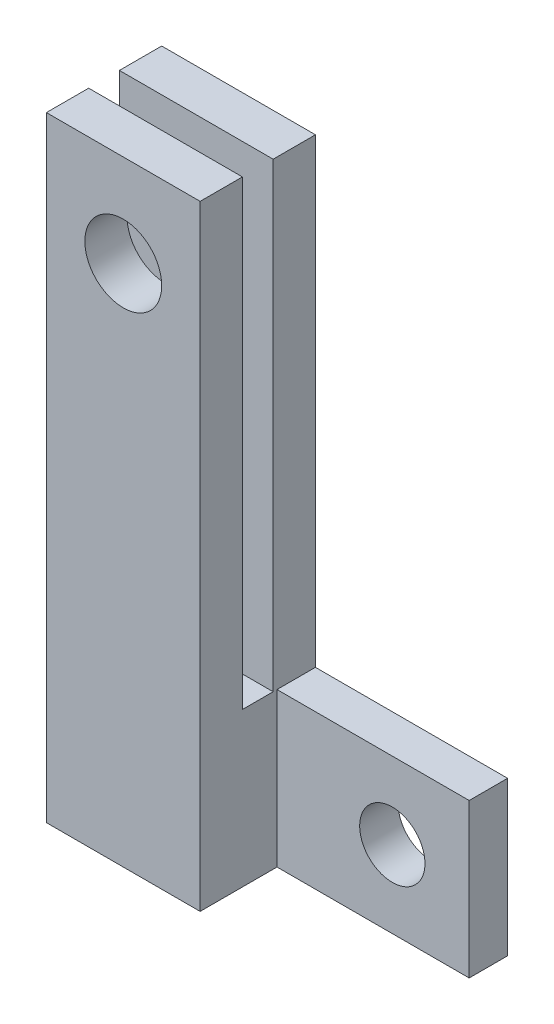
ISO-10303-21;
HEADER;
FILE_DESCRIPTION(('STEP AP214'),'2;1');
FILE_NAME('part.step','',(''),(''),'','','');
FILE_SCHEMA(('AUTOMOTIVE_DESIGN { 1 0 10303 214 1 1 1 1 }'));
ENDSEC;
DATA;
#1=APPLICATION_CONTEXT('core data for automotive mechanical design processes');
#2=APPLICATION_PROTOCOL_DEFINITION('international standard','automotive_design',2000,#1);
#3=PRODUCT_CONTEXT('',#1,'mechanical');
#4=PRODUCT('Part','Part','',(#3));
#5=PRODUCT_RELATED_PRODUCT_CATEGORY('part','',(#4));
#6=PRODUCT_DEFINITION_FORMATION('','',#4);
#7=PRODUCT_DEFINITION_CONTEXT('part definition',#1,'design');
#8=PRODUCT_DEFINITION('design','',#6,#7);
#9=PRODUCT_DEFINITION_SHAPE('','',#8);
#10=(LENGTH_UNIT() NAMED_UNIT(*) SI_UNIT(.MILLI.,.METRE.));
#11=(NAMED_UNIT(*) PLANE_ANGLE_UNIT() SI_UNIT($,.RADIAN.));
#12=(NAMED_UNIT(*) SI_UNIT($,.STERADIAN.) SOLID_ANGLE_UNIT());
#13=UNCERTAINTY_MEASURE_WITH_UNIT(LENGTH_MEASURE(1.E-05),#10,'distance_accuracy_value','');
#14=(GEOMETRIC_REPRESENTATION_CONTEXT(3) GLOBAL_UNCERTAINTY_ASSIGNED_CONTEXT((#13)) GLOBAL_UNIT_ASSIGNED_CONTEXT((#10,
#11,#12)) REPRESENTATION_CONTEXT('',''));
#15=CARTESIAN_POINT('',(0.,0.,0.));
#16=DIRECTION('',(0.,0.,1.));
#17=DIRECTION('',(1.,0.,0.));
#18=AXIS2_PLACEMENT_3D('',#15,#16,#17);
#19=CARTESIAN_POINT('',(-10.,30.8594023067002,15.));
#20=DIRECTION('',(1.,0.,0.));
#21=DIRECTION('',(0.,1.,0.));
#22=AXIS2_PLACEMENT_3D('',#19,#20,#21);
#23=PLANE('',#22);
#24=DIRECTION('',(0.,0.,-1.));
#25=VECTOR('',#24,1.);
#26=CARTESIAN_POINT('',(-10.,-31.1227531452276,0.));
#27=LINE('',#26,#25);
#28=CARTESIAN_POINT('',(-10.,-31.1227531452276,12.));
#29=VERTEX_POINT('',#28);
#30=CARTESIAN_POINT('',(-10.,-31.1227531452276,0.));
#31=VERTEX_POINT('',#30);
#32=EDGE_CURVE('E59',#29,#31,#27,.T.);
#33=ORIENTED_EDGE('',*,*,#32,.F.);
#34=DIRECTION('',(0.,1.,0.));
#35=VECTOR('',#34,1.);
#36=CARTESIAN_POINT('',(-10.,-31.1227531452276,12.));
#37=LINE('',#36,#35);
#38=CARTESIAN_POINT('',(-9.99999999999999,-47.1227531452276,12.));
#39=VERTEX_POINT('',#38);
#40=EDGE_CURVE('E459',#39,#29,#37,.T.);
#41=ORIENTED_EDGE('',*,*,#40,.F.);
#42=DIRECTION('',(0.,0.,1.));
#43=VECTOR('',#42,1.);
#44=CARTESIAN_POINT('',(-9.99999999999999,-47.1227531452276,12.));
#45=LINE('',#44,#43);
#46=CARTESIAN_POINT('',(-9.99999999999999,-47.1227531452276,0.));
#47=VERTEX_POINT('',#46);
#48=EDGE_CURVE('E458',#47,#39,#45,.T.);
#49=ORIENTED_EDGE('',*,*,#48,.F.);
#50=DIRECTION('',(0.,-1.,0.));
#51=VECTOR('',#50,1.);
#52=CARTESIAN_POINT('',(-10.,30.8594023067002,0.));
#53=LINE('',#52,#51);
#54=CARTESIAN_POINT('',(-9.99999999999999,-49.1405976932998,0.));
#55=VERTEX_POINT('',#54);
#56=EDGE_CURVE('E200',#47,#55,#53,.T.);
#57=ORIENTED_EDGE('',*,*,#56,.T.);
#58=DIRECTION('',(0.,0.,-1.));
#59=VECTOR('',#58,1.);
#60=CARTESIAN_POINT('',(-9.99999999999999,-49.1405976932998,5.));
#61=LINE('',#60,#59);
#62=CARTESIAN_POINT('',(-9.99999999999999,-49.1405976932998,15.));
#63=VERTEX_POINT('',#62);
#64=EDGE_CURVE('E287',#63,#55,#61,.T.);
#65=ORIENTED_EDGE('',*,*,#64,.F.);
#66=DIRECTION('',(0.,-1.,0.));
#67=VECTOR('',#66,1.);
#68=CARTESIAN_POINT('',(-10.,30.8594023067002,15.));
#69=LINE('',#68,#67);
#70=CARTESIAN_POINT('',(-10.,30.8594023067002,15.));
#71=VERTEX_POINT('',#70);
#72=EDGE_CURVE('E353',#71,#63,#69,.T.);
#73=ORIENTED_EDGE('',*,*,#72,.F.);
#74=DIRECTION('',(0.,0.,-1.));
#75=VECTOR('',#74,1.);
#76=CARTESIAN_POINT('',(-10.,30.8594023067002,15.));
#77=LINE('',#76,#75);
#78=CARTESIAN_POINT('',(-10.,30.8594023067002,9.5));
#79=VERTEX_POINT('',#78);
#80=EDGE_CURVE('E365',#71,#79,#77,.T.);
#81=ORIENTED_EDGE('',*,*,#80,.T.);
#82=DIRECTION('',(0.,1.,0.));
#83=VECTOR('',#82,1.);
#84=CARTESIAN_POINT('',(-10.,-29.1405976932998,9.5));
#85=LINE('',#84,#83);
#86=CARTESIAN_POINT('',(-10.,-29.1405976932998,9.5));
#87=VERTEX_POINT('',#86);
#88=EDGE_CURVE('E337',#87,#79,#85,.T.);
#89=ORIENTED_EDGE('',*,*,#88,.F.);
#90=DIRECTION('',(0.,0.,1.));
#91=VECTOR('',#90,1.);
#92=CARTESIAN_POINT('',(-10.,-29.1405976932998,5.5));
#93=LINE('',#92,#91);
#94=CARTESIAN_POINT('',(-10.,-29.1405976932998,5.5));
#95=VERTEX_POINT('',#94);
#96=EDGE_CURVE('E320',#95,#87,#93,.T.);
#97=ORIENTED_EDGE('',*,*,#96,.F.);
#98=DIRECTION('',(0.,1.,0.));
#99=VECTOR('',#98,1.);
#100=CARTESIAN_POINT('',(-10.,-29.1405976932998,5.5));
#101=LINE('',#100,#99);
#102=CARTESIAN_POINT('',(-10.,30.8594023067002,5.5));
#103=VERTEX_POINT('',#102);
#104=EDGE_CURVE('E340',#95,#103,#101,.T.);
#105=ORIENTED_EDGE('',*,*,#104,.T.);
#106=CARTESIAN_POINT('',(-10.,30.8594023067002,0.));
#107=VERTEX_POINT('',#106);
#108=EDGE_CURVE('E356',#103,#107,#77,.T.);
#109=ORIENTED_EDGE('',*,*,#108,.T.);
#110=EDGE_CURVE('E64',#107,#31,#53,.T.);
#111=ORIENTED_EDGE('',*,*,#110,.T.);
#112=EDGE_LOOP('',(#33,#41,#49,#57,#65,#73,#81,#89,#97,#105,#109,#111));
#113=FACE_BOUND('',#112,.T.);
#114=ADVANCED_FACE('F41',(#113),#23,.F.);
#115=CARTESIAN_POINT('',(0.,0.,5.));
#116=DIRECTION('',(0.,0.,-1.));
#117=DIRECTION('',(-1.,0.,0.));
#118=AXIS2_PLACEMENT_3D('',#115,#116,#117);
#119=PLANE('',#118);
#120=CARTESIAN_POINT('',(25.,-39.1227531452276,5.));
#121=DIRECTION('',(0.,0.,-1.));
#122=DIRECTION('',(-1.,0.,0.));
#123=AXIS2_PLACEMENT_3D('',#120,#121,#122);
#124=CIRCLE('',#123,4.25000000000001);
#125=CARTESIAN_POINT('',(20.75,-39.1227531452276,5.));
#126=VERTEX_POINT('',#125);
#127=EDGE_CURVE('E45',#126,#126,#124,.T.);
#128=ORIENTED_EDGE('',*,*,#127,.T.);
#129=EDGE_LOOP('',(#128));
#130=FACE_BOUND('',#129,.T.);
#131=DIRECTION('',(0.,-1.,0.));
#132=VECTOR('',#131,1.);
#133=CARTESIAN_POINT('',(10.,30.8594023067002,5.));
#134=LINE('',#133,#132);
#135=CARTESIAN_POINT('',(10.,-29.1405976932998,5.));
#136=VERTEX_POINT('',#135);
#137=CARTESIAN_POINT('',(10.,-49.1405976932998,5.));
#138=VERTEX_POINT('',#137);
#139=EDGE_CURVE('E295',#136,#138,#134,.T.);
#140=ORIENTED_EDGE('',*,*,#139,.T.);
#141=DIRECTION('',(-1.,0.,0.));
#142=VECTOR('',#141,1.);
#143=CARTESIAN_POINT('',(35.,-49.1405976932998,5.));
#144=LINE('',#143,#142);
#145=CARTESIAN_POINT('',(35.,-49.1405976932998,5.));
#146=VERTEX_POINT('',#145);
#147=EDGE_CURVE('E264',#146,#138,#144,.T.);
#148=ORIENTED_EDGE('',*,*,#147,.F.);
#149=DIRECTION('',(0.,-1.,0.));
#150=VECTOR('',#149,1.);
#151=CARTESIAN_POINT('',(35.,-29.1405976932998,5.));
#152=LINE('',#151,#150);
#153=CARTESIAN_POINT('',(35.,-29.1405976932998,5.));
#154=VERTEX_POINT('',#153);
#155=EDGE_CURVE('E260',#154,#146,#152,.T.);
#156=ORIENTED_EDGE('',*,*,#155,.F.);
#157=DIRECTION('',(1.,0.,0.));
#158=VECTOR('',#157,1.);
#159=CARTESIAN_POINT('',(-9.99999999999999,-29.1405976932998,5.));
#160=LINE('',#159,#158);
#161=EDGE_CURVE('E269',#136,#154,#160,.T.);
#162=ORIENTED_EDGE('',*,*,#161,.F.);
#163=EDGE_LOOP('',(#140,#148,#156,#162));
#164=FACE_BOUND('',#163,.T.);
#165=ADVANCED_FACE('F392',(#130,#164),#119,.F.);
#166=CARTESIAN_POINT('',(-10.,30.8594023067002,15.));
#167=DIRECTION('',(0.,-1.,0.));
#168=DIRECTION('',(0.,0.,-1.));
#169=AXIS2_PLACEMENT_3D('',#166,#167,#168);
#170=PLANE('',#169);
#171=DIRECTION('',(0.,0.,-1.));
#172=VECTOR('',#171,1.);
#173=CARTESIAN_POINT('',(10.,30.8594023067002,15.));
#174=LINE('',#173,#172);
#175=CARTESIAN_POINT('',(10.,30.8594023067002,15.));
#176=VERTEX_POINT('',#175);
#177=CARTESIAN_POINT('',(10.,30.8594023067002,9.5));
#178=VERTEX_POINT('',#177);
#179=EDGE_CURVE('E11',#176,#178,#174,.T.);
#180=ORIENTED_EDGE('',*,*,#179,.T.);
#181=DIRECTION('',(1.,0.,0.));
#182=VECTOR('',#181,1.);
#183=CARTESIAN_POINT('',(-10.,30.8594023067002,9.5));
#184=LINE('',#183,#182);
#185=EDGE_CURVE('E317',#79,#178,#184,.T.);
#186=ORIENTED_EDGE('',*,*,#185,.F.);
#187=ORIENTED_EDGE('',*,*,#80,.F.);
#188=DIRECTION('',(-1.,0.,0.));
#189=VECTOR('',#188,1.);
#190=CARTESIAN_POINT('',(-10.,30.8594023067002,15.));
#191=LINE('',#190,#189);
#192=EDGE_CURVE('E350',#176,#71,#191,.T.);
#193=ORIENTED_EDGE('',*,*,#192,.F.);
#194=EDGE_LOOP('',(#180,#186,#187,#193));
#195=FACE_BOUND('',#194,.T.);
#196=ADVANCED_FACE('F399',(#195),#170,.F.);
#197=CARTESIAN_POINT('',(10.,30.8594023067002,15.));
#198=DIRECTION('',(-1.,0.,0.));
#199=DIRECTION('',(0.,-1.,0.));
#200=AXIS2_PLACEMENT_3D('',#197,#198,#199);
#201=PLANE('',#200);
#202=ORIENTED_EDGE('',*,*,#139,.F.);
#203=DIRECTION('',(0.,0.,-1.));
#204=VECTOR('',#203,1.);
#205=CARTESIAN_POINT('',(10.,-29.1405976932998,15.));
#206=LINE('',#205,#204);
#207=CARTESIAN_POINT('',(10.,-29.1405976932998,0.));
#208=VERTEX_POINT('',#207);
#209=EDGE_CURVE('E286',#136,#208,#206,.T.);
#210=ORIENTED_EDGE('',*,*,#209,.T.);
#211=DIRECTION('',(0.,1.,0.));
#212=VECTOR('',#211,1.);
#213=CARTESIAN_POINT('',(10.,30.8594023067002,0.));
#214=LINE('',#213,#212);
#215=CARTESIAN_POINT('',(10.,30.8594023067002,0.));
#216=VERTEX_POINT('',#215);
#217=EDGE_CURVE('E336',#208,#216,#214,.T.);
#218=ORIENTED_EDGE('',*,*,#217,.T.);
#219=CARTESIAN_POINT('',(10.,30.8594023067002,5.5));
#220=VERTEX_POINT('',#219);
#221=EDGE_CURVE('E51',#220,#216,#174,.T.);
#222=ORIENTED_EDGE('',*,*,#221,.F.);
#223=DIRECTION('',(0.,1.,0.));
#224=VECTOR('',#223,1.);
#225=CARTESIAN_POINT('',(10.,-29.1405976932998,5.5));
#226=LINE('',#225,#224);
#227=CARTESIAN_POINT('',(10.,-29.1405976932998,5.5));
#228=VERTEX_POINT('',#227);
#229=EDGE_CURVE('E327',#228,#220,#226,.T.);
#230=ORIENTED_EDGE('',*,*,#229,.F.);
#231=DIRECTION('',(0.,0.,-1.));
#232=VECTOR('',#231,1.);
#233=CARTESIAN_POINT('',(10.,-29.1405976932998,5.5));
#234=LINE('',#233,#232);
#235=CARTESIAN_POINT('',(10.,-29.1405976932998,9.5));
#236=VERTEX_POINT('',#235);
#237=EDGE_CURVE('E312',#236,#228,#234,.T.);
#238=ORIENTED_EDGE('',*,*,#237,.F.);
#239=DIRECTION('',(0.,1.,0.));
#240=VECTOR('',#239,1.);
#241=CARTESIAN_POINT('',(10.,-29.1405976932998,9.5));
#242=LINE('',#241,#240);
#243=EDGE_CURVE('E332',#236,#178,#242,.T.);
#244=ORIENTED_EDGE('',*,*,#243,.T.);
#245=ORIENTED_EDGE('',*,*,#179,.F.);
#246=DIRECTION('',(0.,1.,0.));
#247=VECTOR('',#246,1.);
#248=CARTESIAN_POINT('',(10.,30.8594023067002,15.));
#249=LINE('',#248,#247);
#250=CARTESIAN_POINT('',(10.,-49.1405976932998,15.));
#251=VERTEX_POINT('',#250);
#252=EDGE_CURVE('E346',#251,#176,#249,.T.);
#253=ORIENTED_EDGE('',*,*,#252,.F.);
#254=DIRECTION('',(0.,0.,-1.));
#255=VECTOR('',#254,1.);
#256=CARTESIAN_POINT('',(10.,-49.1405976932998,15.));
#257=LINE('',#256,#255);
#258=EDGE_CURVE('E252',#251,#138,#257,.T.);
#259=ORIENTED_EDGE('',*,*,#258,.T.);
#260=EDGE_LOOP('',(#202,#210,#218,#222,#230,#238,#244,#245,#253,#259));
#261=FACE_BOUND('',#260,.T.);
#262=ADVANCED_FACE('F43',(#261),#201,.F.);
#263=ORIENTED_EDGE('',*,*,#108,.F.);
#264=DIRECTION('',(-1.,0.,0.));
#265=VECTOR('',#264,1.);
#266=CARTESIAN_POINT('',(-10.,30.8594023067002,5.5));
#267=LINE('',#266,#265);
#268=EDGE_CURVE('E311',#220,#103,#267,.T.);
#269=ORIENTED_EDGE('',*,*,#268,.F.);
#270=ORIENTED_EDGE('',*,*,#221,.T.);
#271=DIRECTION('',(-1.,0.,0.));
#272=VECTOR('',#271,1.);
#273=CARTESIAN_POINT('',(-10.,30.8594023067002,0.));
#274=LINE('',#273,#272);
#275=EDGE_CURVE('E359',#216,#107,#274,.T.);
#276=ORIENTED_EDGE('',*,*,#275,.T.);
#277=EDGE_LOOP('',(#263,#269,#270,#276));
#278=FACE_BOUND('',#277,.T.);
#279=ADVANCED_FACE('F404',(#278),#170,.F.);
#280=CARTESIAN_POINT('',(0.,0.,15.));
#281=DIRECTION('',(0.,0.,1.));
#282=DIRECTION('',(1.,0.,0.));
#283=AXIS2_PLACEMENT_3D('',#280,#281,#282);
#284=PLANE('',#283);
#285=CARTESIAN_POINT('',(0.,18.8594023067002,15.));
#286=DIRECTION('',(0.,0.,1.));
#287=DIRECTION('',(1.,0.,0.));
#288=AXIS2_PLACEMENT_3D('',#285,#286,#287);
#289=CIRCLE('',#288,5.);
#290=CARTESIAN_POINT('',(5.,18.8594023067002,15.));
#291=VERTEX_POINT('',#290);
#292=EDGE_CURVE('E298',#291,#291,#289,.T.);
#293=ORIENTED_EDGE('',*,*,#292,.F.);
#294=EDGE_LOOP('',(#293));
#295=FACE_BOUND('',#294,.T.);
#296=ORIENTED_EDGE('',*,*,#252,.T.);
#297=ORIENTED_EDGE('',*,*,#192,.T.);
#298=ORIENTED_EDGE('',*,*,#72,.T.);
#299=DIRECTION('',(1.,0.,0.));
#300=VECTOR('',#299,1.);
#301=CARTESIAN_POINT('',(10.,-49.1405976932998,15.));
#302=LINE('',#301,#300);
#303=EDGE_CURVE('E240',#63,#251,#302,.T.);
#304=ORIENTED_EDGE('',*,*,#303,.T.);
#305=EDGE_LOOP('',(#296,#297,#298,#304));
#306=FACE_BOUND('',#305,.T.);
#307=ADVANCED_FACE('F406',(#295,#306),#284,.T.);
#308=CARTESIAN_POINT('',(0.,0.,0.));
#309=DIRECTION('',(0.,0.,1.));
#310=DIRECTION('',(1.,0.,0.));
#311=AXIS2_PLACEMENT_3D('',#308,#309,#310);
#312=PLANE('',#311);
#313=ORIENTED_EDGE('',*,*,#56,.F.);
#314=DIRECTION('',(1.,0.,0.));
#315=VECTOR('',#314,1.);
#316=CARTESIAN_POINT('',(-11.,-47.1227531452276,0.));
#317=LINE('',#316,#315);
#318=CARTESIAN_POINT('',(-11.,-47.1227531452276,0.));
#319=VERTEX_POINT('',#318);
#320=EDGE_CURVE('E178',#319,#47,#317,.T.);
#321=ORIENTED_EDGE('',*,*,#320,.F.);
#322=DIRECTION('',(0.,-1.,0.));
#323=VECTOR('',#322,1.);
#324=CARTESIAN_POINT('',(-11.,-47.1227531452276,0.));
#325=LINE('',#324,#323);
#326=CARTESIAN_POINT('',(-11.,-31.1227531452276,0.));
#327=VERTEX_POINT('',#326);
#328=EDGE_CURVE('E185',#327,#319,#325,.T.);
#329=ORIENTED_EDGE('',*,*,#328,.F.);
#330=DIRECTION('',(1.,0.,0.));
#331=VECTOR('',#330,1.);
#332=CARTESIAN_POINT('',(-11.,-31.1227531452276,0.));
#333=LINE('',#332,#331);
#334=EDGE_CURVE('E472',#327,#31,#333,.T.);
#335=ORIENTED_EDGE('',*,*,#334,.T.);
#336=ORIENTED_EDGE('',*,*,#110,.F.);
#337=ORIENTED_EDGE('',*,*,#275,.F.);
#338=ORIENTED_EDGE('',*,*,#217,.F.);
#339=DIRECTION('',(1.,0.,0.));
#340=VECTOR('',#339,1.);
#341=CARTESIAN_POINT('',(-9.99999999999999,-29.1405976932998,0.));
#342=LINE('',#341,#340);
#343=CARTESIAN_POINT('',(35.,-29.1405976932998,0.));
#344=VERTEX_POINT('',#343);
#345=EDGE_CURVE('E265',#208,#344,#342,.T.);
#346=ORIENTED_EDGE('',*,*,#345,.T.);
#347=DIRECTION('',(0.,-1.,0.));
#348=VECTOR('',#347,1.);
#349=CARTESIAN_POINT('',(35.,-29.1405976932998,0.));
#350=LINE('',#349,#348);
#351=CARTESIAN_POINT('',(35.,-49.1405976932998,0.));
#352=VERTEX_POINT('',#351);
#353=EDGE_CURVE('E273',#344,#352,#350,.T.);
#354=ORIENTED_EDGE('',*,*,#353,.T.);
#355=DIRECTION('',(-1.,0.,0.));
#356=VECTOR('',#355,1.);
#357=CARTESIAN_POINT('',(35.,-49.1405976932998,0.));
#358=LINE('',#357,#356);
#359=EDGE_CURVE('E277',#352,#55,#358,.T.);
#360=ORIENTED_EDGE('',*,*,#359,.T.);
#361=EDGE_LOOP('',(#313,#321,#329,#335,#336,#337,#338,#346,#354,#360));
#362=FACE_BOUND('',#361,.T.);
#363=CARTESIAN_POINT('',(25.,-39.1227531452276,0.));
#364=DIRECTION('',(0.,0.,-1.));
#365=DIRECTION('',(-1.,0.,0.));
#366=AXIS2_PLACEMENT_3D('',#363,#364,#365);
#367=CIRCLE('',#366,4.25000000000001);
#368=CARTESIAN_POINT('',(20.75,-39.1227531452276,0.));
#369=VERTEX_POINT('',#368);
#370=EDGE_CURVE('E256',#369,#369,#367,.T.);
#371=ORIENTED_EDGE('',*,*,#370,.F.);
#372=EDGE_LOOP('',(#371));
#373=FACE_BOUND('',#372,.T.);
#374=DIRECTION('',(0.,-1.,0.));
#375=VECTOR('',#374,1.);
#376=CARTESIAN_POINT('',(-9.99999999999999,-47.1227531452276,0.));
#377=LINE('',#376,#375);
#378=CARTESIAN_POINT('',(-9.99999999999999,-33.1227531452276,0.));
#379=VERTEX_POINT('',#378);
#380=CARTESIAN_POINT('',(-10.,-45.1227531452276,0.));
#381=VERTEX_POINT('',#380);
#382=EDGE_CURVE('E461',#379,#381,#377,.T.);
#383=ORIENTED_EDGE('',*,*,#382,.T.);
#384=DIRECTION('',(-1.,0.,0.));
#385=VECTOR('',#384,1.);
#386=CARTESIAN_POINT('',(-10.,-45.1227531452276,0.));
#387=LINE('',#386,#385);
#388=CARTESIAN_POINT('',(-4.99999999999998,-45.1227531452276,0.));
#389=VERTEX_POINT('',#388);
#390=EDGE_CURVE('E218',#389,#381,#387,.T.);
#391=ORIENTED_EDGE('',*,*,#390,.F.);
#392=DIRECTION('',(0.,-1.,0.));
#393=VECTOR('',#392,1.);
#394=CARTESIAN_POINT('',(-4.99999999999998,-45.1227531452276,0.));
#395=LINE('',#394,#393);
#396=CARTESIAN_POINT('',(-4.99999999999998,-33.1227531452276,0.));
#397=VERTEX_POINT('',#396);
#398=EDGE_CURVE('E207',#397,#389,#395,.T.);
#399=ORIENTED_EDGE('',*,*,#398,.F.);
#400=DIRECTION('',(1.,0.,0.));
#401=VECTOR('',#400,1.);
#402=CARTESIAN_POINT('',(-4.99999999999998,-33.1227531452276,0.));
#403=LINE('',#402,#401);
#404=EDGE_CURVE('E202',#379,#397,#403,.T.);
#405=ORIENTED_EDGE('',*,*,#404,.F.);
#406=EDGE_LOOP('',(#383,#391,#399,#405));
#407=FACE_BOUND('',#406,.T.);
#408=CARTESIAN_POINT('',(0.,18.8594023067002,0.));
#409=DIRECTION('',(0.,0.,1.));
#410=DIRECTION('',(1.,0.,0.));
#411=AXIS2_PLACEMENT_3D('',#408,#409,#410);
#412=CIRCLE('',#411,5.);
#413=CARTESIAN_POINT('',(5.,18.8594023067002,0.));
#414=VERTEX_POINT('',#413);
#415=EDGE_CURVE('E299',#414,#414,#412,.T.);
#416=ORIENTED_EDGE('',*,*,#415,.T.);
#417=EDGE_LOOP('',(#416));
#418=FACE_BOUND('',#417,.T.);
#419=ADVANCED_FACE('F197',(#362,#373,#407,#418),#312,.F.);
#420=CARTESIAN_POINT('',(-10.,-29.1405976932998,9.5));
#421=DIRECTION('',(0.,0.,1.));
#422=DIRECTION('',(1.,0.,0.));
#423=AXIS2_PLACEMENT_3D('',#420,#421,#422);
#424=PLANE('',#423);
#425=CARTESIAN_POINT('',(0.,18.8594023067002,9.5));
#426=DIRECTION('',(0.,0.,1.));
#427=DIRECTION('',(1.,0.,0.));
#428=AXIS2_PLACEMENT_3D('',#425,#426,#427);
#429=CIRCLE('',#428,5.);
#430=CARTESIAN_POINT('',(5.,18.8594023067002,9.5));
#431=VERTEX_POINT('',#430);
#432=EDGE_CURVE('E307',#431,#431,#429,.T.);
#433=ORIENTED_EDGE('',*,*,#432,.T.);
#434=EDGE_LOOP('',(#433));
#435=FACE_BOUND('',#434,.T.);
#436=ORIENTED_EDGE('',*,*,#185,.T.);
#437=ORIENTED_EDGE('',*,*,#243,.F.);
#438=DIRECTION('',(1.,0.,0.));
#439=VECTOR('',#438,1.);
#440=CARTESIAN_POINT('',(-10.,-29.1405976932998,9.5));
#441=LINE('',#440,#439);
#442=EDGE_CURVE('E323',#87,#236,#441,.T.);
#443=ORIENTED_EDGE('',*,*,#442,.F.);
#444=ORIENTED_EDGE('',*,*,#88,.T.);
#445=EDGE_LOOP('',(#436,#437,#443,#444));
#446=FACE_BOUND('',#445,.T.);
#447=ADVANCED_FACE('F427',(#435,#446),#424,.F.);
#448=CARTESIAN_POINT('',(-10.,-29.1405976932998,5.5));
#449=DIRECTION('',(0.,0.,-1.));
#450=DIRECTION('',(-1.,0.,0.));
#451=AXIS2_PLACEMENT_3D('',#448,#449,#450);
#452=PLANE('',#451);
#453=CARTESIAN_POINT('',(0.,18.8594023067002,5.5));
#454=DIRECTION('',(0.,0.,-1.));
#455=DIRECTION('',(-1.,0.,0.));
#456=AXIS2_PLACEMENT_3D('',#453,#454,#455);
#457=CIRCLE('',#456,5.);
#458=CARTESIAN_POINT('',(-5.,18.8594023067002,5.5));
#459=VERTEX_POINT('',#458);
#460=EDGE_CURVE('E303',#459,#459,#457,.T.);
#461=ORIENTED_EDGE('',*,*,#460,.T.);
#462=EDGE_LOOP('',(#461));
#463=FACE_BOUND('',#462,.T.);
#464=ORIENTED_EDGE('',*,*,#268,.T.);
#465=ORIENTED_EDGE('',*,*,#104,.F.);
#466=DIRECTION('',(-1.,0.,0.));
#467=VECTOR('',#466,1.);
#468=CARTESIAN_POINT('',(-10.,-29.1405976932998,5.5));
#469=LINE('',#468,#467);
#470=EDGE_CURVE('E316',#228,#95,#469,.T.);
#471=ORIENTED_EDGE('',*,*,#470,.F.);
#472=ORIENTED_EDGE('',*,*,#229,.T.);
#473=EDGE_LOOP('',(#464,#465,#471,#472));
#474=FACE_BOUND('',#473,.T.);
#475=ADVANCED_FACE('F372',(#463,#474),#452,.F.);
#476=CARTESIAN_POINT('',(0.,-29.1405976932998,0.));
#477=DIRECTION('',(0.,1.,0.));
#478=DIRECTION('',(0.,0.,1.));
#479=AXIS2_PLACEMENT_3D('',#476,#477,#478);
#480=PLANE('',#479);
#481=ORIENTED_EDGE('',*,*,#237,.T.);
#482=ORIENTED_EDGE('',*,*,#470,.T.);
#483=ORIENTED_EDGE('',*,*,#96,.T.);
#484=ORIENTED_EDGE('',*,*,#442,.T.);
#485=EDGE_LOOP('',(#481,#482,#483,#484));
#486=FACE_BOUND('',#485,.T.);
#487=ADVANCED_FACE('F378',(#486),#480,.T.);
#488=CARTESIAN_POINT('',(0.,18.8594023067002,0.));
#489=DIRECTION('',(0.,0.,1.));
#490=DIRECTION('',(1.,0.,0.));
#491=AXIS2_PLACEMENT_3D('',#488,#489,#490);
#492=CYLINDRICAL_SURFACE('',#491,5.);
#493=ORIENTED_EDGE('',*,*,#415,.F.);
#494=EDGE_LOOP('',(#493));
#495=FACE_BOUND('',#494,.T.);
#496=ORIENTED_EDGE('',*,*,#460,.F.);
#497=EDGE_LOOP('',(#496));
#498=FACE_BOUND('',#497,.T.);
#499=ADVANCED_FACE('F375',(#495,#498),#492,.F.);
#500=ORIENTED_EDGE('',*,*,#292,.T.);
#501=EDGE_LOOP('',(#500));
#502=FACE_BOUND('',#501,.T.);
#503=ORIENTED_EDGE('',*,*,#432,.F.);
#504=EDGE_LOOP('',(#503));
#505=FACE_BOUND('',#504,.T.);
#506=ADVANCED_FACE('F377',(#502,#505),#492,.F.);
#507=CARTESIAN_POINT('',(-9.99999999999999,-29.1405976932998,5.));
#508=DIRECTION('',(0.,1.,0.));
#509=DIRECTION('',(-1.,0.,0.));
#510=AXIS2_PLACEMENT_3D('',#507,#508,#509);
#511=PLANE('',#510);
#512=ORIENTED_EDGE('',*,*,#209,.F.);
#513=ORIENTED_EDGE('',*,*,#161,.T.);
#514=DIRECTION('',(0.,0.,-1.));
#515=VECTOR('',#514,1.);
#516=CARTESIAN_POINT('',(35.,-29.1405976932998,5.));
#517=LINE('',#516,#515);
#518=EDGE_CURVE('E282',#154,#344,#517,.T.);
#519=ORIENTED_EDGE('',*,*,#518,.T.);
#520=ORIENTED_EDGE('',*,*,#345,.F.);
#521=EDGE_LOOP('',(#512,#513,#519,#520));
#522=FACE_BOUND('',#521,.T.);
#523=ADVANCED_FACE('F385',(#522),#511,.T.);
#524=CARTESIAN_POINT('',(35.,-29.1405976932998,5.));
#525=DIRECTION('',(1.,0.,0.));
#526=DIRECTION('',(0.,1.,0.));
#527=AXIS2_PLACEMENT_3D('',#524,#525,#526);
#528=PLANE('',#527);
#529=ORIENTED_EDGE('',*,*,#353,.F.);
#530=ORIENTED_EDGE('',*,*,#518,.F.);
#531=ORIENTED_EDGE('',*,*,#155,.T.);
#532=DIRECTION('',(0.,0.,-1.));
#533=VECTOR('',#532,1.);
#534=CARTESIAN_POINT('',(35.,-49.1405976932998,5.));
#535=LINE('',#534,#533);
#536=EDGE_CURVE('E272',#146,#352,#535,.T.);
#537=ORIENTED_EDGE('',*,*,#536,.T.);
#538=EDGE_LOOP('',(#529,#530,#531,#537));
#539=FACE_BOUND('',#538,.T.);
#540=ADVANCED_FACE('F450',(#539),#528,.T.);
#541=CARTESIAN_POINT('',(35.,-49.1405976932998,5.));
#542=DIRECTION('',(0.,-1.,0.));
#543=DIRECTION('',(1.,0.,0.));
#544=AXIS2_PLACEMENT_3D('',#541,#542,#543);
#545=PLANE('',#544);
#546=ORIENTED_EDGE('',*,*,#359,.F.);
#547=ORIENTED_EDGE('',*,*,#536,.F.);
#548=ORIENTED_EDGE('',*,*,#147,.T.);
#549=ORIENTED_EDGE('',*,*,#258,.F.);
#550=ORIENTED_EDGE('',*,*,#303,.F.);
#551=ORIENTED_EDGE('',*,*,#64,.T.);
#552=EDGE_LOOP('',(#546,#547,#548,#549,#550,#551));
#553=FACE_BOUND('',#552,.T.);
#554=ADVANCED_FACE('F438',(#553),#545,.T.);
#555=CARTESIAN_POINT('',(25.,-39.1227531452276,8.));
#556=DIRECTION('',(0.,0.,-1.));
#557=DIRECTION('',(-1.,0.,0.));
#558=AXIS2_PLACEMENT_3D('',#555,#556,#557);
#559=CYLINDRICAL_SURFACE('',#558,4.25000000000001);
#560=ORIENTED_EDGE('',*,*,#370,.T.);
#561=EDGE_LOOP('',(#560));
#562=FACE_BOUND('',#561,.T.);
#563=ORIENTED_EDGE('',*,*,#127,.F.);
#564=EDGE_LOOP('',(#563));
#565=FACE_BOUND('',#564,.T.);
#566=ADVANCED_FACE('F503',(#562,#565),#559,.F.);
#567=CARTESIAN_POINT('',(-10.,-45.1227531452276,10.));
#568=DIRECTION('',(0.,-1.,0.));
#569=DIRECTION('',(0.,0.,-1.));
#570=AXIS2_PLACEMENT_3D('',#567,#568,#569);
#571=PLANE('',#570);
#572=ORIENTED_EDGE('',*,*,#390,.T.);
#573=DIRECTION('',(0.,0.,-1.));
#574=VECTOR('',#573,1.);
#575=CARTESIAN_POINT('',(-10.,-45.1227531452276,10.));
#576=LINE('',#575,#574);
#577=CARTESIAN_POINT('',(-10.,-45.1227531452276,10.));
#578=VERTEX_POINT('',#577);
#579=EDGE_CURVE('E236',#578,#381,#576,.T.);
#580=ORIENTED_EDGE('',*,*,#579,.F.);
#581=DIRECTION('',(-1.,0.,0.));
#582=VECTOR('',#581,1.);
#583=CARTESIAN_POINT('',(-10.,-45.1227531452276,10.));
#584=LINE('',#583,#582);
#585=CARTESIAN_POINT('',(-4.99999999999998,-45.1227531452276,10.));
#586=VERTEX_POINT('',#585);
#587=EDGE_CURVE('E226',#586,#578,#584,.T.);
#588=ORIENTED_EDGE('',*,*,#587,.F.);
#589=DIRECTION('',(0.,0.,-1.));
#590=VECTOR('',#589,1.);
#591=CARTESIAN_POINT('',(-4.99999999999998,-45.1227531452276,10.));
#592=LINE('',#591,#590);
#593=EDGE_CURVE('E241',#586,#389,#592,.T.);
#594=ORIENTED_EDGE('',*,*,#593,.T.);
#595=EDGE_LOOP('',(#572,#580,#588,#594));
#596=FACE_BOUND('',#595,.T.);
#597=ADVANCED_FACE('F499',(#596),#571,.F.);
#598=CARTESIAN_POINT('',(-4.99999999999998,-45.1227531452276,10.));
#599=DIRECTION('',(1.,0.,0.));
#600=DIRECTION('',(0.,0.,-1.));
#601=AXIS2_PLACEMENT_3D('',#598,#599,#600);
#602=PLANE('',#601);
#603=ORIENTED_EDGE('',*,*,#398,.T.);
#604=ORIENTED_EDGE('',*,*,#593,.F.);
#605=DIRECTION('',(0.,-1.,0.));
#606=VECTOR('',#605,1.);
#607=CARTESIAN_POINT('',(-4.99999999999998,-45.1227531452276,10.));
#608=LINE('',#607,#606);
#609=CARTESIAN_POINT('',(-4.99999999999998,-33.1227531452276,10.));
#610=VERTEX_POINT('',#609);
#611=EDGE_CURVE('E222',#610,#586,#608,.T.);
#612=ORIENTED_EDGE('',*,*,#611,.F.);
#613=DIRECTION('',(0.,0.,-1.));
#614=VECTOR('',#613,1.);
#615=CARTESIAN_POINT('',(-4.99999999999998,-33.1227531452276,10.));
#616=LINE('',#615,#614);
#617=EDGE_CURVE('E244',#610,#397,#616,.T.);
#618=ORIENTED_EDGE('',*,*,#617,.T.);
#619=EDGE_LOOP('',(#603,#604,#612,#618));
#620=FACE_BOUND('',#619,.T.);
#621=ADVANCED_FACE('F502',(#620),#602,.F.);
#622=CARTESIAN_POINT('',(-4.99999999999998,-33.1227531452276,10.));
#623=DIRECTION('',(0.,1.,0.));
#624=DIRECTION('',(0.,0.,1.));
#625=AXIS2_PLACEMENT_3D('',#622,#623,#624);
#626=PLANE('',#625);
#627=ORIENTED_EDGE('',*,*,#404,.T.);
#628=ORIENTED_EDGE('',*,*,#617,.F.);
#629=DIRECTION('',(1.,0.,0.));
#630=VECTOR('',#629,1.);
#631=CARTESIAN_POINT('',(-4.99999999999998,-33.1227531452276,10.));
#632=LINE('',#631,#630);
#633=CARTESIAN_POINT('',(-10.,-33.1227531452276,10.));
#634=VERTEX_POINT('',#633);
#635=EDGE_CURVE('E217',#634,#610,#632,.T.);
#636=ORIENTED_EDGE('',*,*,#635,.F.);
#637=DIRECTION('',(0.,0.,-1.));
#638=VECTOR('',#637,1.);
#639=CARTESIAN_POINT('',(-10.,-33.1227531452276,10.));
#640=LINE('',#639,#638);
#641=EDGE_CURVE('E229',#634,#379,#640,.T.);
#642=ORIENTED_EDGE('',*,*,#641,.T.);
#643=EDGE_LOOP('',(#627,#628,#636,#642));
#644=FACE_BOUND('',#643,.T.);
#645=ADVANCED_FACE('F497',(#644),#626,.F.);
#646=CARTESIAN_POINT('',(0.,0.,10.));
#647=DIRECTION('',(0.,0.,1.));
#648=DIRECTION('',(1.,0.,0.));
#649=AXIS2_PLACEMENT_3D('',#646,#647,#648);
#650=PLANE('',#649);
#651=DIRECTION('',(0.,1.,0.));
#652=VECTOR('',#651,1.);
#653=CARTESIAN_POINT('',(-10.,-33.1227531452276,10.));
#654=LINE('',#653,#652);
#655=EDGE_CURVE('E213',#578,#634,#654,.T.);
#656=ORIENTED_EDGE('',*,*,#655,.T.);
#657=ORIENTED_EDGE('',*,*,#635,.T.);
#658=ORIENTED_EDGE('',*,*,#611,.T.);
#659=ORIENTED_EDGE('',*,*,#587,.T.);
#660=EDGE_LOOP('',(#656,#657,#658,#659));
#661=FACE_BOUND('',#660,.T.);
#662=ADVANCED_FACE('F491',(#661),#650,.F.);
#663=CARTESIAN_POINT('',(-11.,-47.1227531452276,12.));
#664=DIRECTION('',(0.,1.,0.));
#665=DIRECTION('',(-1.,0.,0.));
#666=AXIS2_PLACEMENT_3D('',#663,#664,#665);
#667=PLANE('',#666);
#668=ORIENTED_EDGE('',*,*,#48,.T.);
#669=DIRECTION('',(1.,0.,0.));
#670=VECTOR('',#669,1.);
#671=CARTESIAN_POINT('',(-11.,-47.1227531452276,12.));
#672=LINE('',#671,#670);
#673=CARTESIAN_POINT('',(-11.,-47.1227531452276,12.));
#674=VERTEX_POINT('',#673);
#675=EDGE_CURVE('E180',#674,#39,#672,.T.);
#676=ORIENTED_EDGE('',*,*,#675,.F.);
#677=DIRECTION('',(0.,0.,1.));
#678=VECTOR('',#677,1.);
#679=CARTESIAN_POINT('',(-11.,-47.1227531452276,12.));
#680=LINE('',#679,#678);
#681=EDGE_CURVE('E173',#319,#674,#680,.T.);
#682=ORIENTED_EDGE('',*,*,#681,.F.);
#683=ORIENTED_EDGE('',*,*,#320,.T.);
#684=EDGE_LOOP('',(#668,#676,#682,#683));
#685=FACE_BOUND('',#684,.T.);
#686=ADVANCED_FACE('F176',(#685),#667,.F.);
#687=CARTESIAN_POINT('',(-11.,-31.1227531452276,12.));
#688=DIRECTION('',(0.,0.,-1.));
#689=DIRECTION('',(0.,1.,0.));
#690=AXIS2_PLACEMENT_3D('',#687,#688,#689);
#691=PLANE('',#690);
#692=ORIENTED_EDGE('',*,*,#40,.T.);
#693=DIRECTION('',(1.,0.,0.));
#694=VECTOR('',#693,1.);
#695=CARTESIAN_POINT('',(-11.,-31.1227531452276,12.));
#696=LINE('',#695,#694);
#697=CARTESIAN_POINT('',(-11.,-31.1227531452276,12.));
#698=VERTEX_POINT('',#697);
#699=EDGE_CURVE('E209',#698,#29,#696,.T.);
#700=ORIENTED_EDGE('',*,*,#699,.F.);
#701=DIRECTION('',(0.,1.,0.));
#702=VECTOR('',#701,1.);
#703=CARTESIAN_POINT('',(-11.,-31.1227531452276,12.));
#704=LINE('',#703,#702);
#705=EDGE_CURVE('E184',#674,#698,#704,.T.);
#706=ORIENTED_EDGE('',*,*,#705,.F.);
#707=ORIENTED_EDGE('',*,*,#675,.T.);
#708=EDGE_LOOP('',(#692,#700,#706,#707));
#709=FACE_BOUND('',#708,.T.);
#710=ADVANCED_FACE('F480',(#709),#691,.F.);
#711=CARTESIAN_POINT('',(-11.,-31.1227531452276,0.));
#712=DIRECTION('',(0.,-1.,0.));
#713=DIRECTION('',(1.,0.,0.));
#714=AXIS2_PLACEMENT_3D('',#711,#712,#713);
#715=PLANE('',#714);
#716=ORIENTED_EDGE('',*,*,#32,.T.);
#717=ORIENTED_EDGE('',*,*,#334,.F.);
#718=DIRECTION('',(0.,0.,-1.));
#719=VECTOR('',#718,1.);
#720=CARTESIAN_POINT('',(-11.,-31.1227531452276,0.));
#721=LINE('',#720,#719);
#722=EDGE_CURVE('E190',#698,#327,#721,.T.);
#723=ORIENTED_EDGE('',*,*,#722,.F.);
#724=ORIENTED_EDGE('',*,*,#699,.T.);
#725=EDGE_LOOP('',(#716,#717,#723,#724));
#726=FACE_BOUND('',#725,.T.);
#727=ADVANCED_FACE('F478',(#726),#715,.F.);
#728=CARTESIAN_POINT('',(-11.,0.,0.));
#729=DIRECTION('',(1.,0.,0.));
#730=DIRECTION('',(0.,1.,0.));
#731=AXIS2_PLACEMENT_3D('',#728,#729,#730);
#732=PLANE('',#731);
#733=ORIENTED_EDGE('',*,*,#328,.T.);
#734=ORIENTED_EDGE('',*,*,#681,.T.);
#735=ORIENTED_EDGE('',*,*,#705,.T.);
#736=ORIENTED_EDGE('',*,*,#722,.T.);
#737=EDGE_LOOP('',(#733,#734,#735,#736));
#738=FACE_BOUND('',#737,.T.);
#739=ADVANCED_FACE('F188',(#738),#732,.F.);
#740=CARTESIAN_POINT('',(-10.,0.,0.));
#741=DIRECTION('',(1.,0.,0.));
#742=DIRECTION('',(0.,1.,0.));
#743=AXIS2_PLACEMENT_3D('',#740,#741,#742);
#744=PLANE('',#743);
#745=ORIENTED_EDGE('',*,*,#655,.F.);
#746=ORIENTED_EDGE('',*,*,#579,.T.);
#747=ORIENTED_EDGE('',*,*,#382,.F.);
#748=ORIENTED_EDGE('',*,*,#641,.F.);
#749=EDGE_LOOP('',(#745,#746,#747,#748));
#750=FACE_BOUND('',#749,.T.);
#751=ADVANCED_FACE('F591',(#750),#744,.T.);
#752=CLOSED_SHELL('',(#114,#165,#196,#262,#279,#307,#419,#447,#475,#487,#499,#506,#523,#540,
#554,#566,#597,#621,#645,#662,#686,#710,#727,#739,#751));
#753=MANIFOLD_SOLID_BREP('B2',#752);
#754=ADVANCED_BREP_SHAPE_REPRESENTATION('',(#18,#753),#14);
#755=SHAPE_DEFINITION_REPRESENTATION(#9,#754);
ENDSEC;
END-ISO-10303-21;
